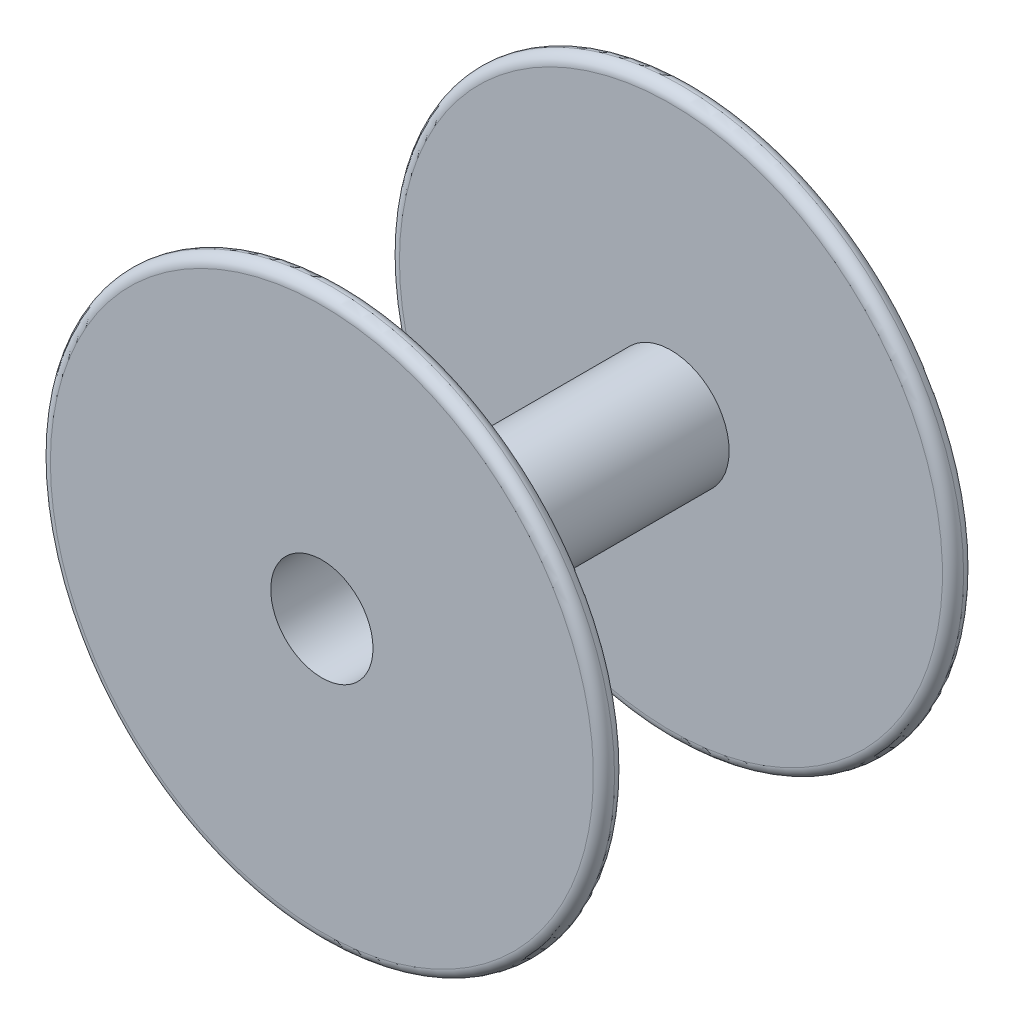
ISO-10303-21;
HEADER;
FILE_DESCRIPTION(('STEP AP214'),'2;1');
FILE_NAME('part.step','',(''),(''),'','','');
FILE_SCHEMA(('AUTOMOTIVE_DESIGN { 1 0 10303 214 1 1 1 1 }'));
ENDSEC;
DATA;
#1=APPLICATION_CONTEXT('core data for automotive mechanical design processes');
#2=APPLICATION_PROTOCOL_DEFINITION('international standard','automotive_design',2000,#1);
#3=PRODUCT_CONTEXT('',#1,'mechanical');
#4=PRODUCT('Part','Part','',(#3));
#5=PRODUCT_RELATED_PRODUCT_CATEGORY('part','',(#4));
#6=PRODUCT_DEFINITION_FORMATION('','',#4);
#7=PRODUCT_DEFINITION_CONTEXT('part definition',#1,'design');
#8=PRODUCT_DEFINITION('design','',#6,#7);
#9=PRODUCT_DEFINITION_SHAPE('','',#8);
#10=(LENGTH_UNIT() NAMED_UNIT(*) SI_UNIT(.MILLI.,.METRE.));
#11=(NAMED_UNIT(*) PLANE_ANGLE_UNIT() SI_UNIT($,.RADIAN.));
#12=(NAMED_UNIT(*) SI_UNIT($,.STERADIAN.) SOLID_ANGLE_UNIT());
#13=UNCERTAINTY_MEASURE_WITH_UNIT(LENGTH_MEASURE(1.E-05),#10,'distance_accuracy_value','');
#14=(GEOMETRIC_REPRESENTATION_CONTEXT(3) GLOBAL_UNCERTAINTY_ASSIGNED_CONTEXT((#13)) GLOBAL_UNIT_ASSIGNED_CONTEXT((#10,
#11,#12)) REPRESENTATION_CONTEXT('',''));
#15=CARTESIAN_POINT('',(0.,0.,0.));
#16=DIRECTION('',(0.,0.,1.));
#17=DIRECTION('',(1.,0.,0.));
#18=AXIS2_PLACEMENT_3D('',#15,#16,#17);
#19=CARTESIAN_POINT('',(0.,80.,52.5));
#20=DIRECTION('',(0.,0.,-1.));
#21=DIRECTION('',(-1.,0.,0.));
#22=AXIS2_PLACEMENT_3D('',#19,#20,#21);
#23=PLANE('',#22);
#24=CARTESIAN_POINT('',(0.,0.,52.5));
#25=DIRECTION('',(0.,0.,-1.));
#26=DIRECTION('',(-1.,0.,0.));
#27=AXIS2_PLACEMENT_3D('',#24,#25,#26);
#28=CIRCLE('',#27,77.);
#29=CARTESIAN_POINT('',(-77.,0.,52.5));
#30=VERTEX_POINT('',#29);
#31=EDGE_CURVE('E95',#30,#30,#28,.F.);
#32=ORIENTED_EDGE('',*,*,#31,.T.);
#33=EDGE_LOOP('',(#32));
#34=FACE_BOUND('',#33,.T.);
#35=CARTESIAN_POINT('',(0.,0.,52.5));
#36=DIRECTION('',(0.,0.,1.));
#37=DIRECTION('',(1.,0.,0.));
#38=AXIS2_PLACEMENT_3D('',#35,#36,#37);
#39=CIRCLE('',#38,14.5);
#40=CARTESIAN_POINT('',(14.5,0.,52.5));
#41=VERTEX_POINT('',#40);
#42=EDGE_CURVE('E96',#41,#41,#39,.T.);
#43=ORIENTED_EDGE('',*,*,#42,.F.);
#44=EDGE_LOOP('',(#43));
#45=FACE_BOUND('',#44,.T.);
#46=ADVANCED_FACE('F30',(#34,#45),#23,.F.);
#47=CARTESIAN_POINT('',(0.,0.,0.));
#48=DIRECTION('',(0.,0.,1.));
#49=DIRECTION('',(1.,0.,0.));
#50=AXIS2_PLACEMENT_3D('',#47,#48,#49);
#51=CYLINDRICAL_SURFACE('',#50,14.5);
#52=CARTESIAN_POINT('',(0.,0.,-52.5));
#53=DIRECTION('',(0.,0.,1.));
#54=DIRECTION('',(1.,0.,0.));
#55=AXIS2_PLACEMENT_3D('',#52,#53,#54);
#56=CIRCLE('',#55,14.5);
#57=CARTESIAN_POINT('',(14.5,0.,-52.5));
#58=VERTEX_POINT('',#57);
#59=EDGE_CURVE('E101',#58,#58,#56,.T.);
#60=ORIENTED_EDGE('',*,*,#59,.F.);
#61=EDGE_LOOP('',(#60));
#62=FACE_BOUND('',#61,.T.);
#63=ORIENTED_EDGE('',*,*,#42,.T.);
#64=EDGE_LOOP('',(#63));
#65=FACE_BOUND('',#64,.T.);
#66=ADVANCED_FACE('F70',(#62,#65),#51,.F.);
#67=CARTESIAN_POINT('',(0.,80.,-52.5));
#68=DIRECTION('',(0.,0.,1.));
#69=DIRECTION('',(1.,0.,0.));
#70=AXIS2_PLACEMENT_3D('',#67,#68,#69);
#71=PLANE('',#70);
#72=CARTESIAN_POINT('',(0.,0.,-52.5));
#73=DIRECTION('',(0.,0.,1.));
#74=DIRECTION('',(1.,0.,0.));
#75=AXIS2_PLACEMENT_3D('',#72,#73,#74);
#76=CIRCLE('',#75,77.);
#77=CARTESIAN_POINT('',(77.,0.,-52.5));
#78=VERTEX_POINT('',#77);
#79=EDGE_CURVE('E38',#78,#78,#76,.F.);
#80=ORIENTED_EDGE('',*,*,#79,.T.);
#81=EDGE_LOOP('',(#80));
#82=FACE_BOUND('',#81,.T.);
#83=ORIENTED_EDGE('',*,*,#59,.T.);
#84=EDGE_LOOP('',(#83));
#85=FACE_BOUND('',#84,.T.);
#86=ADVANCED_FACE('F76',(#82,#85),#71,.F.);
#87=CARTESIAN_POINT('',(0.,16.5,-46.5));
#88=DIRECTION('',(0.,0.,-1.));
#89=DIRECTION('',(-1.,0.,0.));
#90=AXIS2_PLACEMENT_3D('',#87,#88,#89);
#91=PLANE('',#90);
#92=CARTESIAN_POINT('',(0.,0.,-46.5));
#93=DIRECTION('',(0.,0.,-1.));
#94=DIRECTION('',(-1.,0.,0.));
#95=AXIS2_PLACEMENT_3D('',#92,#93,#94);
#96=CIRCLE('',#95,77.);
#97=CARTESIAN_POINT('',(-77.,0.,-46.5));
#98=VERTEX_POINT('',#97);
#99=EDGE_CURVE('E10',#98,#98,#96,.F.);
#100=ORIENTED_EDGE('',*,*,#99,.T.);
#101=EDGE_LOOP('',(#100));
#102=FACE_BOUND('',#101,.T.);
#103=CARTESIAN_POINT('',(0.,0.,-46.5));
#104=DIRECTION('',(0.,0.,1.));
#105=DIRECTION('',(1.,0.,0.));
#106=AXIS2_PLACEMENT_3D('',#103,#104,#105);
#107=CIRCLE('',#106,16.5);
#108=CARTESIAN_POINT('',(16.5,0.,-46.5));
#109=VERTEX_POINT('',#108);
#110=EDGE_CURVE('E52',#109,#109,#107,.T.);
#111=ORIENTED_EDGE('',*,*,#110,.F.);
#112=EDGE_LOOP('',(#111));
#113=FACE_BOUND('',#112,.T.);
#114=ADVANCED_FACE('F108',(#102,#113),#91,.F.);
#115=CARTESIAN_POINT('',(0.,0.,0.));
#116=DIRECTION('',(0.,0.,1.));
#117=DIRECTION('',(1.,0.,0.));
#118=AXIS2_PLACEMENT_3D('',#115,#116,#117);
#119=CYLINDRICAL_SURFACE('',#118,16.5);
#120=CARTESIAN_POINT('',(0.,0.,46.5));
#121=DIRECTION('',(0.,0.,1.));
#122=DIRECTION('',(1.,0.,0.));
#123=AXIS2_PLACEMENT_3D('',#120,#121,#122);
#124=CIRCLE('',#123,16.5);
#125=CARTESIAN_POINT('',(16.5,0.,46.5));
#126=VERTEX_POINT('',#125);
#127=EDGE_CURVE('E48',#126,#126,#124,.T.);
#128=ORIENTED_EDGE('',*,*,#127,.F.);
#129=EDGE_LOOP('',(#128));
#130=FACE_BOUND('',#129,.T.);
#131=ORIENTED_EDGE('',*,*,#110,.T.);
#132=EDGE_LOOP('',(#131));
#133=FACE_BOUND('',#132,.T.);
#134=ADVANCED_FACE('F89',(#130,#133),#119,.T.);
#135=CARTESIAN_POINT('',(0.,16.5,46.5));
#136=DIRECTION('',(0.,0.,1.));
#137=DIRECTION('',(1.,0.,0.));
#138=AXIS2_PLACEMENT_3D('',#135,#136,#137);
#139=PLANE('',#138);
#140=CARTESIAN_POINT('',(0.,0.,46.5));
#141=DIRECTION('',(0.,0.,1.));
#142=DIRECTION('',(1.,0.,0.));
#143=AXIS2_PLACEMENT_3D('',#140,#141,#142);
#144=CIRCLE('',#143,77.);
#145=CARTESIAN_POINT('',(77.,0.,46.5));
#146=VERTEX_POINT('',#145);
#147=EDGE_CURVE('E43',#146,#146,#144,.F.);
#148=ORIENTED_EDGE('',*,*,#147,.T.);
#149=EDGE_LOOP('',(#148));
#150=FACE_BOUND('',#149,.T.);
#151=ORIENTED_EDGE('',*,*,#127,.T.);
#152=EDGE_LOOP('',(#151));
#153=FACE_BOUND('',#152,.T.);
#154=ADVANCED_FACE('F84',(#150,#153),#139,.F.);
#155=CARTESIAN_POINT('',(0.,0.,49.5));
#156=DIRECTION('',(0.,0.,1.));
#157=DIRECTION('',(1.,0.,0.));
#158=AXIS2_PLACEMENT_3D('',#155,#156,#157);
#159=TOROIDAL_SURFACE('',#158,77.,3.);
#160=ORIENTED_EDGE('',*,*,#147,.F.);
#161=EDGE_LOOP('',(#160));
#162=FACE_BOUND('',#161,.T.);
#163=CARTESIAN_POINT('',(0.,0.,49.5));
#164=DIRECTION('',(0.,0.,1.));
#165=DIRECTION('',(1.,0.,0.));
#166=AXIS2_PLACEMENT_3D('',#163,#164,#165);
#167=CIRCLE('',#166,80.);
#168=CARTESIAN_POINT('',(80.,0.,49.5));
#169=VERTEX_POINT('',#168);
#170=EDGE_CURVE('E46',#169,#169,#167,.T.);
#171=ORIENTED_EDGE('',*,*,#170,.F.);
#172=EDGE_LOOP('',(#171));
#173=FACE_BOUND('',#172,.T.);
#174=ADVANCED_FACE('F67',(#162,#173),#159,.T.);
#175=CARTESIAN_POINT('',(0.,0.,49.5));
#176=DIRECTION('',(0.,0.,-1.));
#177=DIRECTION('',(-1.,0.,0.));
#178=AXIS2_PLACEMENT_3D('',#175,#176,#177);
#179=TOROIDAL_SURFACE('',#178,77.,3.);
#180=ORIENTED_EDGE('',*,*,#170,.T.);
#181=EDGE_LOOP('',(#180));
#182=FACE_BOUND('',#181,.T.);
#183=ORIENTED_EDGE('',*,*,#31,.F.);
#184=EDGE_LOOP('',(#183));
#185=FACE_BOUND('',#184,.T.);
#186=ADVANCED_FACE('F60',(#182,#185),#179,.T.);
#187=CARTESIAN_POINT('',(0.,0.,-49.5));
#188=DIRECTION('',(0.,0.,-1.));
#189=DIRECTION('',(-1.,0.,0.));
#190=AXIS2_PLACEMENT_3D('',#187,#188,#189);
#191=TOROIDAL_SURFACE('',#190,77.,3.);
#192=ORIENTED_EDGE('',*,*,#99,.F.);
#193=EDGE_LOOP('',(#192));
#194=FACE_BOUND('',#193,.T.);
#195=CARTESIAN_POINT('',(0.,0.,-49.5));
#196=DIRECTION('',(0.,0.,-1.));
#197=DIRECTION('',(-1.,0.,0.));
#198=AXIS2_PLACEMENT_3D('',#195,#196,#197);
#199=CIRCLE('',#198,80.);
#200=CARTESIAN_POINT('',(-80.,0.,-49.5));
#201=VERTEX_POINT('',#200);
#202=EDGE_CURVE('E34',#201,#201,#199,.T.);
#203=ORIENTED_EDGE('',*,*,#202,.F.);
#204=EDGE_LOOP('',(#203));
#205=FACE_BOUND('',#204,.T.);
#206=ADVANCED_FACE('F32',(#194,#205),#191,.T.);
#207=CARTESIAN_POINT('',(0.,0.,-49.5));
#208=DIRECTION('',(0.,0.,1.));
#209=DIRECTION('',(1.,0.,0.));
#210=AXIS2_PLACEMENT_3D('',#207,#208,#209);
#211=TOROIDAL_SURFACE('',#210,77.,3.);
#212=ORIENTED_EDGE('',*,*,#79,.F.);
#213=EDGE_LOOP('',(#212));
#214=FACE_BOUND('',#213,.T.);
#215=ORIENTED_EDGE('',*,*,#202,.T.);
#216=EDGE_LOOP('',(#215));
#217=FACE_BOUND('',#216,.T.);
#218=ADVANCED_FACE('F57',(#214,#217),#211,.T.);
#219=CLOSED_SHELL('',(#46,#66,#86,#114,#134,#154,#174,#186,#206,#218));
#220=MANIFOLD_SOLID_BREP('B2',#219);
#221=ADVANCED_BREP_SHAPE_REPRESENTATION('',(#18,#220),#14);
#222=SHAPE_DEFINITION_REPRESENTATION(#9,#221);
ENDSEC;
END-ISO-10303-21;
